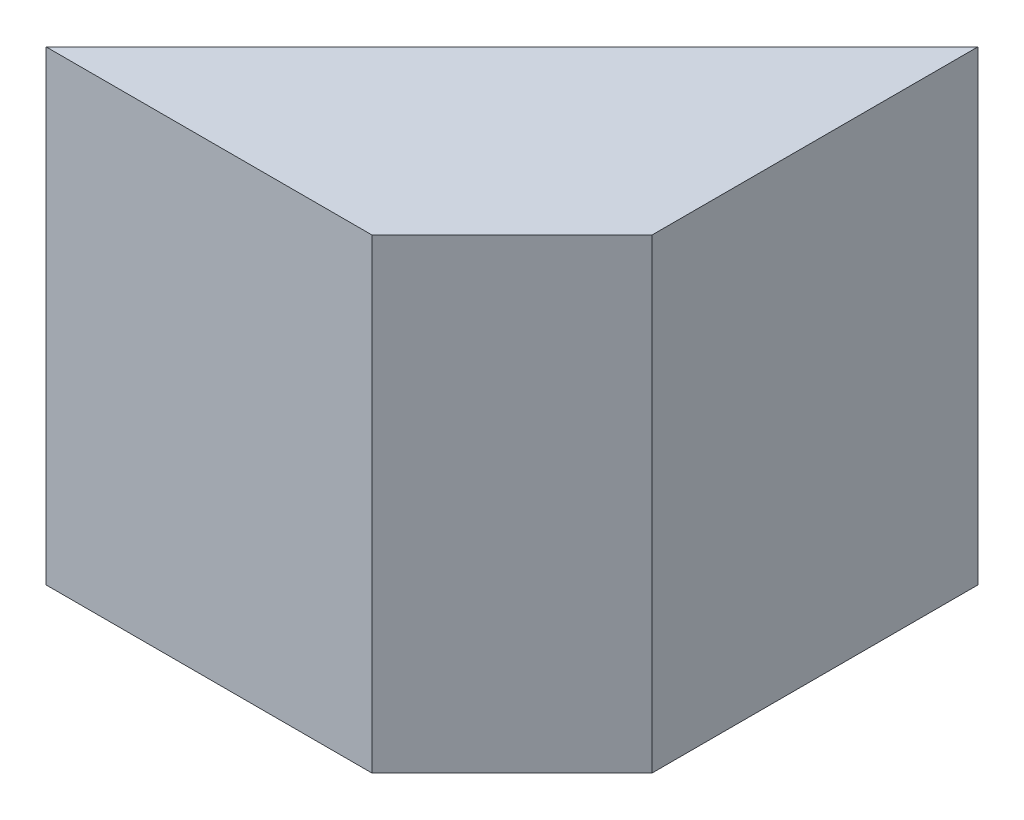
ISO-10303-21;
HEADER;
FILE_DESCRIPTION(('STEP AP214'),'2;1');
FILE_NAME('part.step','',(''),(''),'','','');
FILE_SCHEMA(('AUTOMOTIVE_DESIGN { 1 0 10303 214 1 1 1 1 }'));
ENDSEC;
DATA;
#1=APPLICATION_CONTEXT('core data for automotive mechanical design processes');
#2=APPLICATION_PROTOCOL_DEFINITION('international standard','automotive_design',2000,#1);
#3=PRODUCT_CONTEXT('',#1,'mechanical');
#4=PRODUCT('Part','Part','',(#3));
#5=PRODUCT_RELATED_PRODUCT_CATEGORY('part','',(#4));
#6=PRODUCT_DEFINITION_FORMATION('','',#4);
#7=PRODUCT_DEFINITION_CONTEXT('part definition',#1,'design');
#8=PRODUCT_DEFINITION('design','',#6,#7);
#9=PRODUCT_DEFINITION_SHAPE('','',#8);
#10=(LENGTH_UNIT() NAMED_UNIT(*) SI_UNIT(.MILLI.,.METRE.));
#11=(NAMED_UNIT(*) PLANE_ANGLE_UNIT() SI_UNIT($,.RADIAN.));
#12=(NAMED_UNIT(*) SI_UNIT($,.STERADIAN.) SOLID_ANGLE_UNIT());
#13=UNCERTAINTY_MEASURE_WITH_UNIT(LENGTH_MEASURE(1.E-05),#10,'distance_accuracy_value','');
#14=(GEOMETRIC_REPRESENTATION_CONTEXT(3) GLOBAL_UNCERTAINTY_ASSIGNED_CONTEXT((#13)) GLOBAL_UNIT_ASSIGNED_CONTEXT((#10,
#11,#12)) REPRESENTATION_CONTEXT('',''));
#15=CARTESIAN_POINT('',(0.,0.,0.));
#16=DIRECTION('',(0.,0.,1.));
#17=DIRECTION('',(1.,0.,0.));
#18=AXIS2_PLACEMENT_3D('',#15,#16,#17);
#19=CARTESIAN_POINT('',(10.,10.,0.));
#20=DIRECTION('',(0.,0.,-1.));
#21=DIRECTION('',(-1.,0.,0.));
#22=AXIS2_PLACEMENT_3D('',#19,#20,#21);
#23=PLANE('',#22);
#24=DIRECTION('',(1.,0.,0.));
#25=VECTOR('',#24,1.);
#26=CARTESIAN_POINT('',(10.,0.,0.));
#27=LINE('',#26,#25);
#28=CARTESIAN_POINT('',(0.,0.,0.));
#29=VERTEX_POINT('',#28);
#30=CARTESIAN_POINT('',(6.99999999999999,0.,0.));
#31=VERTEX_POINT('',#30);
#32=EDGE_CURVE('E114',#29,#31,#27,.T.);
#33=ORIENTED_EDGE('',*,*,#32,.T.);
#34=DIRECTION('',(0.,1.,0.));
#35=VECTOR('',#34,1.);
#36=CARTESIAN_POINT('',(6.99999999999999,10.,0.));
#37=LINE('',#36,#35);
#38=CARTESIAN_POINT('',(6.99999999999999,10.,0.));
#39=VERTEX_POINT('',#38);
#40=EDGE_CURVE('E51',#31,#39,#37,.T.);
#41=ORIENTED_EDGE('',*,*,#40,.T.);
#42=DIRECTION('',(1.,0.,0.));
#43=VECTOR('',#42,1.);
#44=CARTESIAN_POINT('',(10.,10.,0.));
#45=LINE('',#44,#43);
#46=CARTESIAN_POINT('',(0.,10.,0.));
#47=VERTEX_POINT('',#46);
#48=EDGE_CURVE('E94',#47,#39,#45,.T.);
#49=ORIENTED_EDGE('',*,*,#48,.F.);
#50=DIRECTION('',(0.,-1.,0.));
#51=VECTOR('',#50,1.);
#52=CARTESIAN_POINT('',(0.,10.,0.));
#53=LINE('',#52,#51);
#54=EDGE_CURVE('E104',#47,#29,#53,.T.);
#55=ORIENTED_EDGE('',*,*,#54,.T.);
#56=EDGE_LOOP('',(#33,#41,#49,#55));
#57=FACE_BOUND('',#56,.T.);
#58=ADVANCED_FACE('F41',(#57),#23,.F.);
#59=CARTESIAN_POINT('',(10.,10.,-10.));
#60=DIRECTION('',(-1.,0.,0.));
#61=DIRECTION('',(0.,0.,1.));
#62=AXIS2_PLACEMENT_3D('',#59,#60,#61);
#63=PLANE('',#62);
#64=DIRECTION('',(0.,0.,-1.));
#65=VECTOR('',#64,1.);
#66=CARTESIAN_POINT('',(10.,10.,-10.));
#67=LINE('',#66,#65);
#68=CARTESIAN_POINT('',(10.,10.,-3.));
#69=VERTEX_POINT('',#68);
#70=CARTESIAN_POINT('',(10.,10.,-10.));
#71=VERTEX_POINT('',#70);
#72=EDGE_CURVE('E83',#69,#71,#67,.T.);
#73=ORIENTED_EDGE('',*,*,#72,.F.);
#74=DIRECTION('',(0.,-1.,0.));
#75=VECTOR('',#74,1.);
#76=CARTESIAN_POINT('',(10.,10.,-3.));
#77=LINE('',#76,#75);
#78=CARTESIAN_POINT('',(10.,0.,-3.));
#79=VERTEX_POINT('',#78);
#80=EDGE_CURVE('E103',#69,#79,#77,.T.);
#81=ORIENTED_EDGE('',*,*,#80,.T.);
#82=DIRECTION('',(0.,0.,-1.));
#83=VECTOR('',#82,1.);
#84=CARTESIAN_POINT('',(10.,0.,-10.));
#85=LINE('',#84,#83);
#86=CARTESIAN_POINT('',(10.,0.,-10.));
#87=VERTEX_POINT('',#86);
#88=EDGE_CURVE('E99',#79,#87,#85,.T.);
#89=ORIENTED_EDGE('',*,*,#88,.T.);
#90=DIRECTION('',(0.,-1.,0.));
#91=VECTOR('',#90,1.);
#92=CARTESIAN_POINT('',(10.,10.,-10.));
#93=LINE('',#92,#91);
#94=EDGE_CURVE('E97',#71,#87,#93,.T.);
#95=ORIENTED_EDGE('',*,*,#94,.F.);
#96=EDGE_LOOP('',(#73,#81,#89,#95));
#97=FACE_BOUND('',#96,.T.);
#98=ADVANCED_FACE('F98',(#97),#63,.F.);
#99=CARTESIAN_POINT('',(0.,10.,0.));
#100=DIRECTION('',(0.707106781186549,0.,0.707106781186546));
#101=DIRECTION('',(0.707106781186546,0.,-0.707106781186549));
#102=AXIS2_PLACEMENT_3D('',#99,#100,#101);
#103=PLANE('',#102);
#104=DIRECTION('',(-0.707106781186546,0.,0.707106781186549));
#105=VECTOR('',#104,1.);
#106=CARTESIAN_POINT('',(0.,0.,0.));
#107=LINE('',#106,#105);
#108=EDGE_CURVE('E119',#87,#29,#107,.T.);
#109=ORIENTED_EDGE('',*,*,#108,.T.);
#110=ORIENTED_EDGE('',*,*,#54,.F.);
#111=DIRECTION('',(-0.707106781186546,0.,0.707106781186549));
#112=VECTOR('',#111,1.);
#113=CARTESIAN_POINT('',(0.,10.,0.));
#114=LINE('',#113,#112);
#115=EDGE_CURVE('E87',#71,#47,#114,.T.);
#116=ORIENTED_EDGE('',*,*,#115,.F.);
#117=ORIENTED_EDGE('',*,*,#94,.T.);
#118=EDGE_LOOP('',(#109,#110,#116,#117));
#119=FACE_BOUND('',#118,.T.);
#120=ADVANCED_FACE('F106',(#119),#103,.F.);
#121=CARTESIAN_POINT('',(0.,10.,0.));
#122=DIRECTION('',(0.,1.,0.));
#123=DIRECTION('',(0.,0.,1.));
#124=AXIS2_PLACEMENT_3D('',#121,#122,#123);
#125=PLANE('',#124);
#126=ORIENTED_EDGE('',*,*,#48,.T.);
#127=DIRECTION('',(-0.707106781186549,0.,0.707106781186546));
#128=VECTOR('',#127,1.);
#129=CARTESIAN_POINT('',(3.49999999999998,10.,3.5));
#130=LINE('',#129,#128);
#131=EDGE_CURVE('E11',#39,#69,#130,.F.);
#132=ORIENTED_EDGE('',*,*,#131,.T.);
#133=ORIENTED_EDGE('',*,*,#72,.T.);
#134=ORIENTED_EDGE('',*,*,#115,.T.);
#135=EDGE_LOOP('',(#126,#132,#133,#134));
#136=FACE_BOUND('',#135,.T.);
#137=ADVANCED_FACE('F85',(#136),#125,.T.);
#138=CARTESIAN_POINT('',(0.,0.,0.));
#139=DIRECTION('',(0.,1.,0.));
#140=DIRECTION('',(0.,0.,1.));
#141=AXIS2_PLACEMENT_3D('',#138,#139,#140);
#142=PLANE('',#141);
#143=ORIENTED_EDGE('',*,*,#88,.F.);
#144=DIRECTION('',(0.707106781186549,0.,-0.707106781186546));
#145=VECTOR('',#144,1.);
#146=CARTESIAN_POINT('',(10.,0.,-3.));
#147=LINE('',#146,#145);
#148=EDGE_CURVE('E65',#79,#31,#147,.F.);
#149=ORIENTED_EDGE('',*,*,#148,.T.);
#150=ORIENTED_EDGE('',*,*,#32,.F.);
#151=ORIENTED_EDGE('',*,*,#108,.F.);
#152=EDGE_LOOP('',(#143,#149,#150,#151));
#153=FACE_BOUND('',#152,.T.);
#154=ADVANCED_FACE('F127',(#153),#142,.F.);
#155=CARTESIAN_POINT('',(10.,10.,-3.));
#156=DIRECTION('',(-0.707106781186546,0.,-0.707106781186549));
#157=DIRECTION('',(0.,-1.,0.));
#158=AXIS2_PLACEMENT_3D('',#155,#156,#157);
#159=PLANE('',#158);
#160=ORIENTED_EDGE('',*,*,#131,.F.);
#161=ORIENTED_EDGE('',*,*,#40,.F.);
#162=ORIENTED_EDGE('',*,*,#148,.F.);
#163=ORIENTED_EDGE('',*,*,#80,.F.);
#164=EDGE_LOOP('',(#160,#161,#162,#163));
#165=FACE_BOUND('',#164,.T.);
#166=ADVANCED_FACE('F44',(#165),#159,.F.);
#167=CLOSED_SHELL('',(#58,#98,#120,#137,#154,#166));
#168=MANIFOLD_SOLID_BREP('B2',#167);
#169=ADVANCED_BREP_SHAPE_REPRESENTATION('',(#18,#168),#14);
#170=SHAPE_DEFINITION_REPRESENTATION(#9,#169);
ENDSEC;
END-ISO-10303-21;
